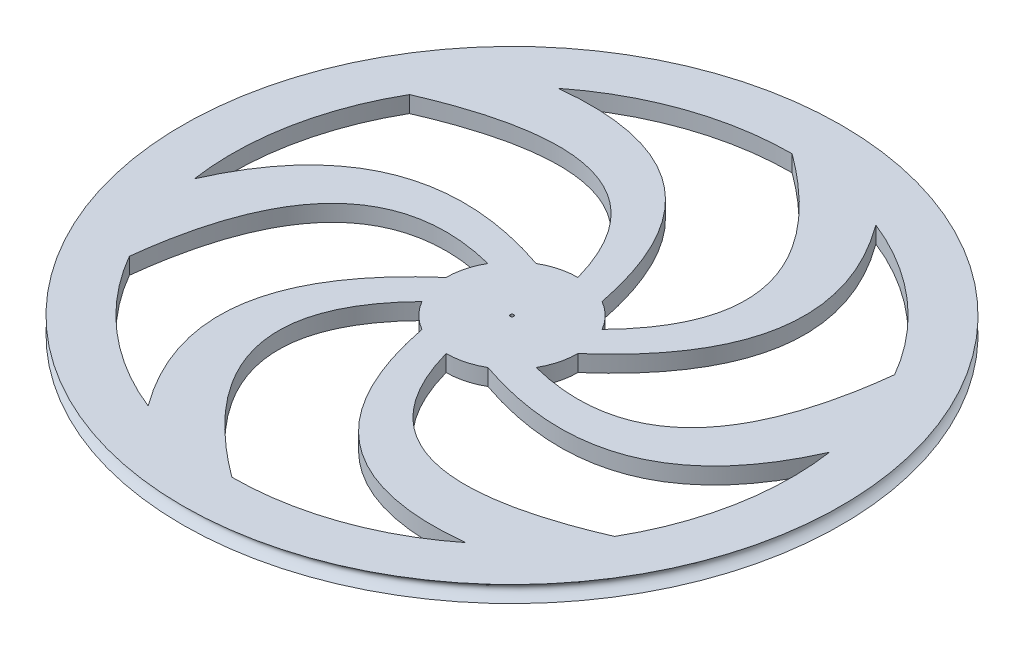
ISO-10303-21;
HEADER;
FILE_DESCRIPTION(('STEP AP214'),'2;1');
FILE_NAME('part.step','',(''),(''),'','','');
FILE_SCHEMA(('AUTOMOTIVE_DESIGN { 1 0 10303 214 1 1 1 1 }'));
ENDSEC;
DATA;
#1=APPLICATION_CONTEXT('core data for automotive mechanical design processes');
#2=APPLICATION_PROTOCOL_DEFINITION('international standard','automotive_design',2000,#1);
#3=PRODUCT_CONTEXT('',#1,'mechanical');
#4=PRODUCT('Part','Part','',(#3));
#5=PRODUCT_RELATED_PRODUCT_CATEGORY('part','',(#4));
#6=PRODUCT_DEFINITION_FORMATION('','',#4);
#7=PRODUCT_DEFINITION_CONTEXT('part definition',#1,'design');
#8=PRODUCT_DEFINITION('design','',#6,#7);
#9=PRODUCT_DEFINITION_SHAPE('','',#8);
#10=(LENGTH_UNIT() NAMED_UNIT(*) SI_UNIT(.MILLI.,.METRE.));
#11=(NAMED_UNIT(*) PLANE_ANGLE_UNIT() SI_UNIT($,.RADIAN.));
#12=(NAMED_UNIT(*) SI_UNIT($,.STERADIAN.) SOLID_ANGLE_UNIT());
#13=UNCERTAINTY_MEASURE_WITH_UNIT(LENGTH_MEASURE(1.E-05),#10,'distance_accuracy_value','');
#14=(GEOMETRIC_REPRESENTATION_CONTEXT(3) GLOBAL_UNCERTAINTY_ASSIGNED_CONTEXT((#13)) GLOBAL_UNIT_ASSIGNED_CONTEXT((#10,
#11,#12)) REPRESENTATION_CONTEXT('',''));
#15=CARTESIAN_POINT('',(0.,0.,0.));
#16=DIRECTION('',(0.,0.,1.));
#17=DIRECTION('',(1.,0.,0.));
#18=AXIS2_PLACEMENT_3D('',#15,#16,#17);
#19=CARTESIAN_POINT('',(0.,3.175,0.));
#20=DIRECTION('',(0.,-1.,0.));
#21=DIRECTION('',(0.,0.,-1.));
#22=AXIS2_PLACEMENT_3D('',#19,#20,#21);
#23=CYLINDRICAL_SURFACE('',#22,12.7);
#24=CARTESIAN_POINT('',(0.,0.,0.));
#25=DIRECTION('',(0.,1.,0.));
#26=DIRECTION('',(0.,0.,1.));
#27=AXIS2_PLACEMENT_3D('',#24,#25,#26);
#28=CIRCLE('',#27,12.7);
#29=CARTESIAN_POINT('',(10.9985226280624,0.,6.35000000000001));
#30=VERTEX_POINT('',#29);
#31=CARTESIAN_POINT('',(12.7,0.,0.));
#32=VERTEX_POINT('',#31);
#33=EDGE_CURVE('E390',#30,#32,#28,.T.);
#34=ORIENTED_EDGE('',*,*,#33,.T.);
#35=DIRECTION('',(0.,-1.,0.));
#36=VECTOR('',#35,1.);
#37=CARTESIAN_POINT('',(12.7,3.175,0.));
#38=LINE('',#37,#36);
#39=CARTESIAN_POINT('',(12.7,3.175,0.));
#40=VERTEX_POINT('',#39);
#41=EDGE_CURVE('E11',#40,#32,#38,.T.);
#42=ORIENTED_EDGE('',*,*,#41,.F.);
#43=CARTESIAN_POINT('',(0.,3.175,0.));
#44=DIRECTION('',(0.,1.,0.));
#45=DIRECTION('',(0.,0.,1.));
#46=AXIS2_PLACEMENT_3D('',#43,#44,#45);
#47=CIRCLE('',#46,12.7);
#48=CARTESIAN_POINT('',(10.9985226280624,3.175,6.35000000000001));
#49=VERTEX_POINT('',#48);
#50=EDGE_CURVE('E212',#49,#40,#47,.T.);
#51=ORIENTED_EDGE('',*,*,#50,.F.);
#52=DIRECTION('',(0.,-1.,0.));
#53=VECTOR('',#52,1.);
#54=CARTESIAN_POINT('',(10.9985226280624,3.175,6.35000000000001));
#55=LINE('',#54,#53);
#56=EDGE_CURVE('E55',#49,#30,#55,.T.);
#57=ORIENTED_EDGE('',*,*,#56,.T.);
#58=EDGE_LOOP('',(#34,#42,#51,#57));
#59=FACE_BOUND('',#58,.T.);
#60=ADVANCED_FACE('F35',(#59),#23,.T.);
#61=CARTESIAN_POINT('',(12.7,3.175,0.));
#62=CARTESIAN_POINT('',(39.5572930429573,3.175,-23.4186437139194));
#63=CARTESIAN_POINT('',(19.9617838015857,3.175,-50.1480589101787));
#64=B_SPLINE_CURVE_WITH_KNOTS('',2,(#61,#62,#63),.UNSPECIFIED.,.F.,.F.,(3,3),(0.,1.),.UNSPECIFIED.);
#65=DIRECTION('',(0.,-1.,0.));
#66=VECTOR('',#65,1.);
#67=SURFACE_OF_LINEAR_EXTRUSION('',#64,#66);
#68=CARTESIAN_POINT('',(12.7,0.,0.));
#69=CARTESIAN_POINT('',(39.5572930429573,0.,-23.4186437139194));
#70=CARTESIAN_POINT('',(19.9617838015857,0.,-50.1480589101787));
#71=B_SPLINE_CURVE_WITH_KNOTS('',2,(#68,#69,#70),.UNSPECIFIED.,.F.,.F.,(3,3),(0.,1.),.UNSPECIFIED.);
#72=CARTESIAN_POINT('',(19.9617838015857,0.,-50.1480589101787));
#73=VERTEX_POINT('',#72);
#74=EDGE_CURVE('E218',#32,#73,#71,.T.);
#75=ORIENTED_EDGE('',*,*,#74,.T.);
#76=DIRECTION('',(0.,-1.,0.));
#77=VECTOR('',#76,1.);
#78=CARTESIAN_POINT('',(19.9617838015857,3.175,-50.1480589101787));
#79=LINE('',#78,#77);
#80=CARTESIAN_POINT('',(19.9617838015857,3.175,-50.1480589101787));
#81=VERTEX_POINT('',#80);
#82=EDGE_CURVE('E46',#81,#73,#79,.T.);
#83=ORIENTED_EDGE('',*,*,#82,.F.);
#84=EDGE_CURVE('E205',#40,#81,#64,.T.);
#85=ORIENTED_EDGE('',*,*,#84,.F.);
#86=ORIENTED_EDGE('',*,*,#41,.T.);
#87=EDGE_LOOP('',(#75,#83,#85,#86));
#88=FACE_BOUND('',#87,.T.);
#89=ADVANCED_FACE('F217',(#88),#67,.F.);
#90=CARTESIAN_POINT('',(0.,3.175,0.));
#91=DIRECTION('',(0.,-1.,0.));
#92=DIRECTION('',(0.,0.,-1.));
#93=AXIS2_PLACEMENT_3D('',#90,#91,#92);
#94=CYLINDRICAL_SURFACE('',#93,53.975);
#95=CARTESIAN_POINT('',(0.,0.,0.));
#96=DIRECTION('',(0.,1.,0.));
#97=DIRECTION('',(0.,0.,1.));
#98=AXIS2_PLACEMENT_3D('',#95,#96,#97);
#99=CIRCLE('',#98,53.975);
#100=CARTESIAN_POINT('',(46.7437211692651,0.,-26.9875000000001));
#101=VERTEX_POINT('',#100);
#102=EDGE_CURVE('E395',#101,#73,#99,.T.);
#103=ORIENTED_EDGE('',*,*,#102,.F.);
#104=DIRECTION('',(0.,-1.,0.));
#105=VECTOR('',#104,1.);
#106=CARTESIAN_POINT('',(46.7437211692651,3.175,-26.9875000000001));
#107=LINE('',#106,#105);
#108=CARTESIAN_POINT('',(46.7437211692651,3.175,-26.9875000000001));
#109=VERTEX_POINT('',#108);
#110=EDGE_CURVE('E129',#109,#101,#107,.T.);
#111=ORIENTED_EDGE('',*,*,#110,.F.);
#112=CARTESIAN_POINT('',(0.,3.175,0.));
#113=DIRECTION('',(0.,1.,0.));
#114=DIRECTION('',(0.,0.,1.));
#115=AXIS2_PLACEMENT_3D('',#112,#113,#114);
#116=CIRCLE('',#115,53.975);
#117=EDGE_CURVE('E211',#109,#81,#116,.T.);
#118=ORIENTED_EDGE('',*,*,#117,.T.);
#119=ORIENTED_EDGE('',*,*,#82,.T.);
#120=EDGE_LOOP('',(#103,#111,#118,#119));
#121=FACE_BOUND('',#120,.T.);
#122=ADVANCED_FACE('F222',(#121),#94,.F.);
#123=CARTESIAN_POINT('',(-10.9985226280623,3.175,-6.35000000000009));
#124=CARTESIAN_POINT('',(-42.014338018492,3.175,-14.2639829231854));
#125=CARTESIAN_POINT('',(-46.7437211692653,3.175,26.9874999999996));
#126=B_SPLINE_CURVE_WITH_KNOTS('',2,(#123,#124,#125),.UNSPECIFIED.,.F.,.F.,(3,3),(0.,1.),.UNSPECIFIED.);
#127=DIRECTION('',(0.,-1.,0.));
#128=VECTOR('',#127,1.);
#129=SURFACE_OF_LINEAR_EXTRUSION('',#126,#128);
#130=CARTESIAN_POINT('',(-10.9985226280623,0.,-6.35000000000009));
#131=CARTESIAN_POINT('',(-42.014338018492,0.,-14.2639829231854));
#132=CARTESIAN_POINT('',(-46.7437211692653,0.,26.9874999999996));
#133=B_SPLINE_CURVE_WITH_KNOTS('',2,(#130,#131,#132),.UNSPECIFIED.,.F.,.F.,(3,3),(0.,1.),.UNSPECIFIED.);
#134=CARTESIAN_POINT('',(-10.9985226280623,0.,-6.35000000000009));
#135=VERTEX_POINT('',#134);
#136=CARTESIAN_POINT('',(-46.7437211692653,0.,26.9874999999996));
#137=VERTEX_POINT('',#136);
#138=EDGE_CURVE('E556',#135,#137,#133,.T.);
#139=ORIENTED_EDGE('',*,*,#138,.F.);
#140=DIRECTION('',(0.,-1.,0.));
#141=VECTOR('',#140,1.);
#142=CARTESIAN_POINT('',(-10.9985226280623,3.175,-6.35000000000009));
#143=LINE('',#142,#141);
#144=CARTESIAN_POINT('',(-10.9985226280623,3.175,-6.35000000000009));
#145=VERTEX_POINT('',#144);
#146=EDGE_CURVE('E420',#145,#135,#143,.T.);
#147=ORIENTED_EDGE('',*,*,#146,.F.);
#148=CARTESIAN_POINT('',(-46.7437211692653,3.175,26.9874999999996));
#149=VERTEX_POINT('',#148);
#150=EDGE_CURVE('E264',#145,#149,#126,.T.);
#151=ORIENTED_EDGE('',*,*,#150,.T.);
#152=DIRECTION('',(0.,-1.,0.));
#153=VECTOR('',#152,1.);
#154=CARTESIAN_POINT('',(-46.7437211692653,3.175,26.9874999999996));
#155=LINE('',#154,#153);
#156=EDGE_CURVE('E422',#149,#137,#155,.T.);
#157=ORIENTED_EDGE('',*,*,#156,.T.);
#158=EDGE_LOOP('',(#139,#147,#151,#157));
#159=FACE_BOUND('',#158,.T.);
#160=ADVANCED_FACE('F297',(#159),#129,.T.);
#161=CARTESIAN_POINT('',(0.,3.175,0.));
#162=DIRECTION('',(0.,-1.,0.));
#163=DIRECTION('',(0.,0.,-1.));
#164=AXIS2_PLACEMENT_3D('',#161,#162,#163);
#165=CYLINDRICAL_SURFACE('',#164,12.7);
#166=CARTESIAN_POINT('',(0.,0.,0.));
#167=DIRECTION('',(0.,1.,0.));
#168=DIRECTION('',(0.,0.,1.));
#169=AXIS2_PLACEMENT_3D('',#166,#167,#168);
#170=CIRCLE('',#169,12.7);
#171=CARTESIAN_POINT('',(-12.7,0.,0.));
#172=VERTEX_POINT('',#171);
#173=EDGE_CURVE('E517',#135,#172,#170,.T.);
#174=ORIENTED_EDGE('',*,*,#173,.T.);
#175=DIRECTION('',(0.,-1.,0.));
#176=VECTOR('',#175,1.);
#177=CARTESIAN_POINT('',(-12.7,3.175,0.));
#178=LINE('',#177,#176);
#179=CARTESIAN_POINT('',(-12.7,3.175,0.));
#180=VERTEX_POINT('',#179);
#181=EDGE_CURVE('E427',#180,#172,#178,.T.);
#182=ORIENTED_EDGE('',*,*,#181,.F.);
#183=CARTESIAN_POINT('',(0.,3.175,0.));
#184=DIRECTION('',(0.,1.,0.));
#185=DIRECTION('',(0.,0.,1.));
#186=AXIS2_PLACEMENT_3D('',#183,#184,#185);
#187=CIRCLE('',#186,12.7);
#188=EDGE_CURVE('E269',#145,#180,#187,.T.);
#189=ORIENTED_EDGE('',*,*,#188,.F.);
#190=ORIENTED_EDGE('',*,*,#146,.T.);
#191=EDGE_LOOP('',(#174,#182,#189,#190));
#192=FACE_BOUND('',#191,.T.);
#193=ADVANCED_FACE('F372',(#192),#165,.T.);
#194=CARTESIAN_POINT('',(-12.7,3.175,0.));
#195=CARTESIAN_POINT('',(-39.5572930429574,3.175,23.4186437139191));
#196=CARTESIAN_POINT('',(-19.9617838015861,3.175,50.1480589101785));
#197=B_SPLINE_CURVE_WITH_KNOTS('',2,(#194,#195,#196),.UNSPECIFIED.,.F.,.F.,(3,3),(0.,1.),.UNSPECIFIED.);
#198=DIRECTION('',(0.,-1.,0.));
#199=VECTOR('',#198,1.);
#200=SURFACE_OF_LINEAR_EXTRUSION('',#197,#199);
#201=CARTESIAN_POINT('',(-12.7,0.,0.));
#202=CARTESIAN_POINT('',(-39.5572930429574,0.,23.4186437139191));
#203=CARTESIAN_POINT('',(-19.9617838015861,0.,50.1480589101785));
#204=B_SPLINE_CURVE_WITH_KNOTS('',2,(#201,#202,#203),.UNSPECIFIED.,.F.,.F.,(3,3),(0.,1.),.UNSPECIFIED.);
#205=CARTESIAN_POINT('',(-19.9617838015861,0.,50.1480589101785));
#206=VERTEX_POINT('',#205);
#207=EDGE_CURVE('E398',#172,#206,#204,.T.);
#208=ORIENTED_EDGE('',*,*,#207,.T.);
#209=DIRECTION('',(0.,-1.,0.));
#210=VECTOR('',#209,1.);
#211=CARTESIAN_POINT('',(-19.9617838015861,3.175,50.1480589101785));
#212=LINE('',#211,#210);
#213=CARTESIAN_POINT('',(-19.9617838015861,3.175,50.1480589101785));
#214=VERTEX_POINT('',#213);
#215=EDGE_CURVE('E424',#214,#206,#212,.T.);
#216=ORIENTED_EDGE('',*,*,#215,.F.);
#217=EDGE_CURVE('E232',#180,#214,#197,.T.);
#218=ORIENTED_EDGE('',*,*,#217,.F.);
#219=ORIENTED_EDGE('',*,*,#181,.T.);
#220=EDGE_LOOP('',(#208,#216,#218,#219));
#221=FACE_BOUND('',#220,.T.);
#222=ADVANCED_FACE('F302',(#221),#200,.F.);
#223=CARTESIAN_POINT('',(-10.9985226280624,3.175,6.34999999999993));
#224=CARTESIAN_POINT('',(-33.3601405798719,3.175,29.2534925856078));
#225=CARTESIAN_POINT('',(-3.69497971292815E-13,3.175,53.975));
#226=B_SPLINE_CURVE_WITH_KNOTS('',2,(#223,#224,#225),.UNSPECIFIED.,.F.,.F.,(3,3),(0.,1.),.UNSPECIFIED.);
#227=DIRECTION('',(0.,-1.,0.));
#228=VECTOR('',#227,1.);
#229=SURFACE_OF_LINEAR_EXTRUSION('',#226,#228);
#230=CARTESIAN_POINT('',(-10.9985226280624,0.,6.34999999999993));
#231=CARTESIAN_POINT('',(-33.3601405798719,0.,29.2534925856078));
#232=CARTESIAN_POINT('',(-3.69497971292815E-13,0.,53.975));
#233=B_SPLINE_CURVE_WITH_KNOTS('',2,(#230,#231,#232),.UNSPECIFIED.,.F.,.F.,(3,3),(0.,1.),.UNSPECIFIED.);
#234=CARTESIAN_POINT('',(-10.9985226280624,0.,6.34999999999994));
#235=VERTEX_POINT('',#234);
#236=CARTESIAN_POINT('',(-1.84748985646408E-13,0.,53.975));
#237=VERTEX_POINT('',#236);
#238=EDGE_CURVE('E540',#235,#237,#233,.T.);
#239=ORIENTED_EDGE('',*,*,#238,.F.);
#240=DIRECTION('',(0.,-1.,0.));
#241=VECTOR('',#240,1.);
#242=CARTESIAN_POINT('',(-10.9985226280624,3.175,6.34999999999994));
#243=LINE('',#242,#241);
#244=CARTESIAN_POINT('',(-10.9985226280624,3.175,6.34999999999994));
#245=VERTEX_POINT('',#244);
#246=EDGE_CURVE('E425',#245,#235,#243,.T.);
#247=ORIENTED_EDGE('',*,*,#246,.F.);
#248=CARTESIAN_POINT('',(-1.84748985646408E-13,3.175,53.975));
#249=VERTEX_POINT('',#248);
#250=EDGE_CURVE('E260',#245,#249,#226,.T.);
#251=ORIENTED_EDGE('',*,*,#250,.T.);
#252=DIRECTION('',(0.,-1.,0.));
#253=VECTOR('',#252,1.);
#254=CARTESIAN_POINT('',(-1.84748985646408E-13,3.175,53.975));
#255=LINE('',#254,#253);
#256=EDGE_CURVE('E431',#249,#237,#255,.T.);
#257=ORIENTED_EDGE('',*,*,#256,.T.);
#258=EDGE_LOOP('',(#239,#247,#251,#257));
#259=FACE_BOUND('',#258,.T.);
#260=ADVANCED_FACE('F299',(#259),#229,.T.);
#261=CARTESIAN_POINT('',(-6.35000000000005,0.,10.9985226280623));
#262=VERTEX_POINT('',#261);
#263=EDGE_CURVE('E548',#235,#262,#170,.T.);
#264=ORIENTED_EDGE('',*,*,#263,.T.);
#265=DIRECTION('',(0.,-1.,0.));
#266=VECTOR('',#265,1.);
#267=CARTESIAN_POINT('',(-6.35000000000005,3.175,10.9985226280623));
#268=LINE('',#267,#266);
#269=CARTESIAN_POINT('',(-6.35000000000005,3.175,10.9985226280623));
#270=VERTEX_POINT('',#269);
#271=EDGE_CURVE('E436',#270,#262,#268,.T.);
#272=ORIENTED_EDGE('',*,*,#271,.F.);
#273=EDGE_CURVE('E253',#245,#270,#187,.T.);
#274=ORIENTED_EDGE('',*,*,#273,.F.);
#275=ORIENTED_EDGE('',*,*,#246,.T.);
#276=EDGE_LOOP('',(#264,#272,#274,#275));
#277=FACE_BOUND('',#276,.T.);
#278=ADVANCED_FACE('F295',(#277),#165,.T.);
#279=CARTESIAN_POINT('',(-6.35000000000005,3.175,10.9985226280623));
#280=CARTESIAN_POINT('',(0.502493856952142,3.175,45.9669425371061));
#281=CARTESIAN_POINT('',(33.4486010659002,3.175,42.3614413321154));
#282=B_SPLINE_CURVE_WITH_KNOTS('',2,(#279,#280,#281),.UNSPECIFIED.,.F.,.F.,(3,3),(0.,1.),.UNSPECIFIED.);
#283=DIRECTION('',(0.,-1.,0.));
#284=VECTOR('',#283,1.);
#285=SURFACE_OF_LINEAR_EXTRUSION('',#282,#284);
#286=CARTESIAN_POINT('',(-6.35000000000005,0.,10.9985226280623));
#287=CARTESIAN_POINT('',(0.502493856952142,0.,45.9669425371061));
#288=CARTESIAN_POINT('',(33.4486010659002,0.,42.3614413321154));
#289=B_SPLINE_CURVE_WITH_KNOTS('',2,(#286,#287,#288),.UNSPECIFIED.,.F.,.F.,(3,3),(0.,1.),.UNSPECIFIED.);
#290=CARTESIAN_POINT('',(33.4486010659002,0.,42.3614413321154));
#291=VERTEX_POINT('',#290);
#292=EDGE_CURVE('E549',#262,#291,#289,.T.);
#293=ORIENTED_EDGE('',*,*,#292,.T.);
#294=DIRECTION('',(0.,-1.,0.));
#295=VECTOR('',#294,1.);
#296=CARTESIAN_POINT('',(33.4486010659002,3.175,42.3614413321154));
#297=LINE('',#296,#295);
#298=CARTESIAN_POINT('',(33.4486010659002,3.175,42.3614413321154));
#299=VERTEX_POINT('',#298);
#300=EDGE_CURVE('E433',#299,#291,#297,.T.);
#301=ORIENTED_EDGE('',*,*,#300,.F.);
#302=EDGE_CURVE('E265',#270,#299,#282,.T.);
#303=ORIENTED_EDGE('',*,*,#302,.F.);
#304=ORIENTED_EDGE('',*,*,#271,.T.);
#305=EDGE_LOOP('',(#293,#301,#303,#304));
#306=FACE_BOUND('',#305,.T.);
#307=ADVANCED_FACE('F290',(#306),#285,.F.);
#308=CARTESIAN_POINT('',(0.,0.,12.7));
#309=VERTEX_POINT('',#308);
#310=CARTESIAN_POINT('',(6.34999999999997,0.,10.9985226280624));
#311=VERTEX_POINT('',#310);
#312=EDGE_CURVE('E518',#309,#311,#170,.T.);
#313=ORIENTED_EDGE('',*,*,#312,.T.);
#314=DIRECTION('',(0.,-1.,0.));
#315=VECTOR('',#314,1.);
#316=CARTESIAN_POINT('',(6.34999999999997,3.175,10.9985226280624));
#317=LINE('',#316,#315);
#318=CARTESIAN_POINT('',(6.34999999999997,3.175,10.9985226280624));
#319=VERTEX_POINT('',#318);
#320=EDGE_CURVE('E434',#319,#311,#317,.T.);
#321=ORIENTED_EDGE('',*,*,#320,.F.);
#322=CARTESIAN_POINT('',(0.,3.175,12.7));
#323=VERTEX_POINT('',#322);
#324=EDGE_CURVE('E244',#323,#319,#187,.T.);
#325=ORIENTED_EDGE('',*,*,#324,.F.);
#326=DIRECTION('',(0.,-1.,0.));
#327=VECTOR('',#326,1.);
#328=CARTESIAN_POINT('',(0.,3.175,12.7));
#329=LINE('',#328,#327);
#330=EDGE_CURVE('E440',#323,#309,#329,.T.);
#331=ORIENTED_EDGE('',*,*,#330,.T.);
#332=EDGE_LOOP('',(#313,#321,#325,#331));
#333=FACE_BOUND('',#332,.T.);
#334=ADVANCED_FACE('F294',(#333),#165,.T.);
#335=CARTESIAN_POINT('',(6.34999999999997,3.175,10.9985226280624));
#336=CARTESIAN_POINT('',(40.0597868999095,3.175,22.5482988231868));
#337=CARTESIAN_POINT('',(53.4103848674862,3.175,-7.78661757806325));
#338=B_SPLINE_CURVE_WITH_KNOTS('',2,(#335,#336,#337),.UNSPECIFIED.,.F.,.F.,(3,3),(0.,1.),.UNSPECIFIED.);
#339=DIRECTION('',(0.,-1.,0.));
#340=VECTOR('',#339,1.);
#341=SURFACE_OF_LINEAR_EXTRUSION('',#338,#340);
#342=CARTESIAN_POINT('',(6.34999999999997,0.,10.9985226280624));
#343=CARTESIAN_POINT('',(40.0597868999095,0.,22.5482988231868));
#344=CARTESIAN_POINT('',(53.4103848674862,0.,-7.78661757806325));
#345=B_SPLINE_CURVE_WITH_KNOTS('',2,(#342,#343,#344),.UNSPECIFIED.,.F.,.F.,(3,3),(0.,1.),.UNSPECIFIED.);
#346=CARTESIAN_POINT('',(53.4103848674862,0.,-7.78661757806325));
#347=VERTEX_POINT('',#346);
#348=EDGE_CURVE('E523',#311,#347,#345,.T.);
#349=ORIENTED_EDGE('',*,*,#348,.T.);
#350=DIRECTION('',(0.,-1.,0.));
#351=VECTOR('',#350,1.);
#352=CARTESIAN_POINT('',(53.4103848674862,3.175,-7.78661757806325));
#353=LINE('',#352,#351);
#354=CARTESIAN_POINT('',(53.4103848674862,3.175,-7.78661757806325));
#355=VERTEX_POINT('',#354);
#356=EDGE_CURVE('E445',#355,#347,#353,.T.);
#357=ORIENTED_EDGE('',*,*,#356,.F.);
#358=EDGE_CURVE('E250',#319,#355,#338,.T.);
#359=ORIENTED_EDGE('',*,*,#358,.F.);
#360=ORIENTED_EDGE('',*,*,#320,.T.);
#361=EDGE_LOOP('',(#349,#357,#359,#360));
#362=FACE_BOUND('',#361,.T.);
#363=ADVANCED_FACE('F310',(#362),#341,.F.);
#364=CARTESIAN_POINT('',(46.7437211692651,0.,26.9875000000001));
#365=VERTEX_POINT('',#364);
#366=EDGE_CURVE('E531',#365,#347,#99,.T.);
#367=ORIENTED_EDGE('',*,*,#366,.F.);
#368=DIRECTION('',(0.,-1.,0.));
#369=VECTOR('',#368,1.);
#370=CARTESIAN_POINT('',(46.7437211692651,3.175,26.9875000000001));
#371=LINE('',#370,#369);
#372=CARTESIAN_POINT('',(46.7437211692651,3.175,26.9875000000001));
#373=VERTEX_POINT('',#372);
#374=EDGE_CURVE('E442',#373,#365,#371,.T.);
#375=ORIENTED_EDGE('',*,*,#374,.F.);
#376=EDGE_CURVE('E246',#373,#355,#116,.T.);
#377=ORIENTED_EDGE('',*,*,#376,.T.);
#378=ORIENTED_EDGE('',*,*,#356,.T.);
#379=EDGE_LOOP('',(#367,#375,#377,#378));
#380=FACE_BOUND('',#379,.T.);
#381=ADVANCED_FACE('F339',(#380),#94,.F.);
#382=CARTESIAN_POINT('',(1.30971622436249E-13,3.175,-12.7));
#383=CARTESIAN_POINT('',(-8.65419743861992,3.175,-43.5174755087932));
#384=CARTESIAN_POINT('',(-46.7437211692648,3.175,-26.9875000000005));
#385=B_SPLINE_CURVE_WITH_KNOTS('',2,(#382,#383,#384),.UNSPECIFIED.,.F.,.F.,(3,3),(0.,1.),.UNSPECIFIED.);
#386=DIRECTION('',(0.,-1.,0.));
#387=VECTOR('',#386,1.);
#388=SURFACE_OF_LINEAR_EXTRUSION('',#385,#387);
#389=CARTESIAN_POINT('',(1.30971622436249E-13,0.,-12.7));
#390=CARTESIAN_POINT('',(-8.65419743861992,0.,-43.5174755087932));
#391=CARTESIAN_POINT('',(-46.7437211692648,0.,-26.9875000000005));
#392=B_SPLINE_CURVE_WITH_KNOTS('',2,(#389,#390,#391),.UNSPECIFIED.,.F.,.F.,(3,3),(0.,1.),.UNSPECIFIED.);
#393=CARTESIAN_POINT('',(0.,0.,-12.7));
#394=VERTEX_POINT('',#393);
#395=CARTESIAN_POINT('',(-46.7437211692648,0.,-26.9875000000005));
#396=VERTEX_POINT('',#395);
#397=EDGE_CURVE('E505',#394,#396,#392,.T.);
#398=ORIENTED_EDGE('',*,*,#397,.F.);
#399=DIRECTION('',(0.,-1.,0.));
#400=VECTOR('',#399,1.);
#401=CARTESIAN_POINT('',(0.,3.175,-12.7));
#402=LINE('',#401,#400);
#403=CARTESIAN_POINT('',(0.,3.175,-12.7));
#404=VERTEX_POINT('',#403);
#405=EDGE_CURVE('E443',#404,#394,#402,.T.);
#406=ORIENTED_EDGE('',*,*,#405,.F.);
#407=CARTESIAN_POINT('',(-46.7437211692648,3.175,-26.9875000000005));
#408=VERTEX_POINT('',#407);
#409=EDGE_CURVE('E241',#404,#408,#385,.T.);
#410=ORIENTED_EDGE('',*,*,#409,.T.);
#411=DIRECTION('',(0.,-1.,0.));
#412=VECTOR('',#411,1.);
#413=CARTESIAN_POINT('',(-46.7437211692648,3.175,-26.9875000000005));
#414=LINE('',#413,#412);
#415=EDGE_CURVE('E449',#408,#396,#414,.T.);
#416=ORIENTED_EDGE('',*,*,#415,.T.);
#417=EDGE_LOOP('',(#398,#406,#410,#416));
#418=FACE_BOUND('',#417,.T.);
#419=ADVANCED_FACE('F336',(#418),#388,.T.);
#420=CARTESIAN_POINT('',(-6.3499999999999,0.,-10.9985226280624));
#421=VERTEX_POINT('',#420);
#422=EDGE_CURVE('E510',#394,#421,#170,.T.);
#423=ORIENTED_EDGE('',*,*,#422,.T.);
#424=DIRECTION('',(0.,-1.,0.));
#425=VECTOR('',#424,1.);
#426=CARTESIAN_POINT('',(-6.3499999999999,3.175,-10.9985226280624));
#427=LINE('',#426,#425);
#428=CARTESIAN_POINT('',(-6.3499999999999,3.175,-10.9985226280624));
#429=VERTEX_POINT('',#428);
#430=EDGE_CURVE('E453',#429,#421,#427,.T.);
#431=ORIENTED_EDGE('',*,*,#430,.F.);
#432=EDGE_CURVE('E252',#404,#429,#187,.T.);
#433=ORIENTED_EDGE('',*,*,#432,.F.);
#434=ORIENTED_EDGE('',*,*,#405,.T.);
#435=EDGE_LOOP('',(#423,#431,#433,#434));
#436=FACE_BOUND('',#435,.T.);
#437=ADVANCED_FACE('F334',(#436),#165,.T.);
#438=CARTESIAN_POINT('',(-6.3499999999999,3.175,-10.9985226280624));
#439=CARTESIAN_POINT('',(-40.0597868999093,3.175,-22.548298823187));
#440=CARTESIAN_POINT('',(-53.4103848674862,3.175,7.78661757806289));
#441=B_SPLINE_CURVE_WITH_KNOTS('',2,(#438,#439,#440),.UNSPECIFIED.,.F.,.F.,(3,3),(0.,1.),.UNSPECIFIED.);
#442=DIRECTION('',(0.,-1.,0.));
#443=VECTOR('',#442,1.);
#444=SURFACE_OF_LINEAR_EXTRUSION('',#441,#443);
#445=CARTESIAN_POINT('',(-6.3499999999999,0.,-10.9985226280624));
#446=CARTESIAN_POINT('',(-40.0597868999093,0.,-22.548298823187));
#447=CARTESIAN_POINT('',(-53.4103848674862,0.,7.78661757806289));
#448=B_SPLINE_CURVE_WITH_KNOTS('',2,(#445,#446,#447),.UNSPECIFIED.,.F.,.F.,(3,3),(0.,1.),.UNSPECIFIED.);
#449=CARTESIAN_POINT('',(-53.4103848674862,0.,7.78661757806289));
#450=VERTEX_POINT('',#449);
#451=EDGE_CURVE('E516',#421,#450,#448,.T.);
#452=ORIENTED_EDGE('',*,*,#451,.T.);
#453=DIRECTION('',(0.,-1.,0.));
#454=VECTOR('',#453,1.);
#455=CARTESIAN_POINT('',(-53.4103848674862,3.175,7.78661757806289));
#456=LINE('',#455,#454);
#457=CARTESIAN_POINT('',(-53.4103848674862,3.175,7.78661757806289));
#458=VERTEX_POINT('',#457);
#459=EDGE_CURVE('E451',#458,#450,#456,.T.);
#460=ORIENTED_EDGE('',*,*,#459,.F.);
#461=EDGE_CURVE('E245',#429,#458,#441,.T.);
#462=ORIENTED_EDGE('',*,*,#461,.F.);
#463=ORIENTED_EDGE('',*,*,#430,.T.);
#464=EDGE_LOOP('',(#452,#460,#462,#463));
#465=FACE_BOUND('',#464,.T.);
#466=ADVANCED_FACE('F331',(#465),#444,.F.);
#467=CARTESIAN_POINT('',(10.9985226280624,3.175,-6.35));
#468=CARTESIAN_POINT('',(33.3601405798718,3.175,-29.253492585608));
#469=CARTESIAN_POINT('',(0.,3.175,-53.975));
#470=B_SPLINE_CURVE_WITH_KNOTS('',2,(#467,#468,#469),.UNSPECIFIED.,.F.,.F.,(3,3),(0.,1.),.UNSPECIFIED.);
#471=DIRECTION('',(0.,-1.,0.));
#472=VECTOR('',#471,1.);
#473=SURFACE_OF_LINEAR_EXTRUSION('',#470,#472);
#474=CARTESIAN_POINT('',(10.9985226280624,0.,-6.35));
#475=CARTESIAN_POINT('',(33.3601405798718,0.,-29.253492585608));
#476=CARTESIAN_POINT('',(0.,0.,-53.975));
#477=B_SPLINE_CURVE_WITH_KNOTS('',2,(#474,#475,#476),.UNSPECIFIED.,.F.,.F.,(3,3),(0.,1.),.UNSPECIFIED.);
#478=CARTESIAN_POINT('',(10.9985226280624,0.,-6.35000000000001));
#479=VERTEX_POINT('',#478);
#480=CARTESIAN_POINT('',(0.,0.,-53.975));
#481=VERTEX_POINT('',#480);
#482=EDGE_CURVE('E476',#479,#481,#477,.T.);
#483=ORIENTED_EDGE('',*,*,#482,.F.);
#484=DIRECTION('',(0.,-1.,0.));
#485=VECTOR('',#484,1.);
#486=CARTESIAN_POINT('',(10.9985226280624,3.175,-6.35000000000001));
#487=LINE('',#486,#485);
#488=CARTESIAN_POINT('',(10.9985226280624,3.175,-6.35000000000001));
#489=VERTEX_POINT('',#488);
#490=EDGE_CURVE('E40',#489,#479,#487,.T.);
#491=ORIENTED_EDGE('',*,*,#490,.F.);
#492=CARTESIAN_POINT('',(0.,3.175,-53.975));
#493=VERTEX_POINT('',#492);
#494=EDGE_CURVE('E415',#489,#493,#470,.T.);
#495=ORIENTED_EDGE('',*,*,#494,.T.);
#496=DIRECTION('',(0.,-1.,0.));
#497=VECTOR('',#496,1.);
#498=CARTESIAN_POINT('',(0.,3.175,-53.975));
#499=LINE('',#498,#497);
#500=EDGE_CURVE('E227',#493,#481,#499,.T.);
#501=ORIENTED_EDGE('',*,*,#500,.T.);
#502=EDGE_LOOP('',(#483,#491,#495,#501));
#503=FACE_BOUND('',#502,.T.);
#504=ADVANCED_FACE('F37',(#503),#473,.T.);
#505=CARTESIAN_POINT('',(0.,3.175,0.));
#506=DIRECTION('',(0.,-1.,0.));
#507=DIRECTION('',(0.,0.,-1.));
#508=AXIS2_PLACEMENT_3D('',#505,#506,#507);
#509=CYLINDRICAL_SURFACE('',#508,12.7);
#510=CARTESIAN_POINT('',(0.,0.,0.));
#511=DIRECTION('',(0.,1.,0.));
#512=DIRECTION('',(0.,0.,1.));
#513=AXIS2_PLACEMENT_3D('',#510,#511,#512);
#514=CIRCLE('',#513,12.7);
#515=CARTESIAN_POINT('',(6.35000000000013,0.,-10.9985226280623));
#516=VERTEX_POINT('',#515);
#517=EDGE_CURVE('E469',#479,#516,#514,.T.);
#518=ORIENTED_EDGE('',*,*,#517,.T.);
#519=DIRECTION('',(0.,-1.,0.));
#520=VECTOR('',#519,1.);
#521=CARTESIAN_POINT('',(6.35000000000013,3.175,-10.9985226280623));
#522=LINE('',#521,#520);
#523=CARTESIAN_POINT('',(6.35000000000013,3.175,-10.9985226280623));
#524=VERTEX_POINT('',#523);
#525=EDGE_CURVE('E459',#524,#516,#522,.T.);
#526=ORIENTED_EDGE('',*,*,#525,.F.);
#527=CARTESIAN_POINT('',(0.,3.175,0.));
#528=DIRECTION('',(0.,1.,0.));
#529=DIRECTION('',(0.,0.,1.));
#530=AXIS2_PLACEMENT_3D('',#527,#528,#529);
#531=CIRCLE('',#530,12.7);
#532=EDGE_CURVE('E242',#489,#524,#531,.T.);
#533=ORIENTED_EDGE('',*,*,#532,.F.);
#534=ORIENTED_EDGE('',*,*,#490,.T.);
#535=EDGE_LOOP('',(#518,#526,#533,#534));
#536=FACE_BOUND('',#535,.T.);
#537=ADVANCED_FACE('F468',(#536),#509,.T.);
#538=CARTESIAN_POINT('',(6.35000000000013,3.175,-10.9985226280623));
#539=CARTESIAN_POINT('',(-0.502493856951835,3.175,-45.9669425371061));
#540=CARTESIAN_POINT('',(-33.4486010658999,3.175,-42.3614413321157));
#541=B_SPLINE_CURVE_WITH_KNOTS('',2,(#538,#539,#540),.UNSPECIFIED.,.F.,.F.,(3,3),(0.,1.),.UNSPECIFIED.);
#542=DIRECTION('',(0.,-1.,0.));
#543=VECTOR('',#542,1.);
#544=SURFACE_OF_LINEAR_EXTRUSION('',#541,#543);
#545=CARTESIAN_POINT('',(6.35000000000013,0.,-10.9985226280623));
#546=CARTESIAN_POINT('',(-0.502493856951835,0.,-45.9669425371061));
#547=CARTESIAN_POINT('',(-33.4486010658999,0.,-42.3614413321157));
#548=B_SPLINE_CURVE_WITH_KNOTS('',2,(#545,#546,#547),.UNSPECIFIED.,.F.,.F.,(3,3),(0.,1.),.UNSPECIFIED.);
#549=CARTESIAN_POINT('',(-33.4486010658999,0.,-42.3614413321157));
#550=VERTEX_POINT('',#549);
#551=EDGE_CURVE('E478',#516,#550,#548,.T.);
#552=ORIENTED_EDGE('',*,*,#551,.T.);
#553=DIRECTION('',(0.,-1.,0.));
#554=VECTOR('',#553,1.);
#555=CARTESIAN_POINT('',(-33.4486010658999,3.175,-42.3614413321157));
#556=LINE('',#555,#554);
#557=CARTESIAN_POINT('',(-33.4486010658999,3.175,-42.3614413321157));
#558=VERTEX_POINT('',#557);
#559=EDGE_CURVE('E458',#558,#550,#556,.T.);
#560=ORIENTED_EDGE('',*,*,#559,.F.);
#561=EDGE_CURVE('E236',#524,#558,#541,.T.);
#562=ORIENTED_EDGE('',*,*,#561,.F.);
#563=ORIENTED_EDGE('',*,*,#525,.T.);
#564=EDGE_LOOP('',(#552,#560,#562,#563));
#565=FACE_BOUND('',#564,.T.);
#566=ADVANCED_FACE('F626',(#565),#544,.F.);
#567=CARTESIAN_POINT('',(10.9985226280624,3.175,6.35000000000001));
#568=CARTESIAN_POINT('',(42.0143380184921,3.175,14.2639829231851));
#569=CARTESIAN_POINT('',(46.7437211692651,3.175,-26.9875));
#570=B_SPLINE_CURVE_WITH_KNOTS('',2,(#567,#568,#569),.UNSPECIFIED.,.F.,.F.,(3,3),(0.,1.),.UNSPECIFIED.);
#571=DIRECTION('',(0.,-1.,0.));
#572=VECTOR('',#571,1.);
#573=SURFACE_OF_LINEAR_EXTRUSION('',#570,#572);
#574=CARTESIAN_POINT('',(10.9985226280624,0.,6.35000000000001));
#575=CARTESIAN_POINT('',(42.0143380184921,0.,14.2639829231851));
#576=CARTESIAN_POINT('',(46.7437211692651,0.,-26.9875));
#577=B_SPLINE_CURVE_WITH_KNOTS('',2,(#574,#575,#576),.UNSPECIFIED.,.F.,.F.,(3,3),(0.,1.),.UNSPECIFIED.);
#578=EDGE_CURVE('E408',#30,#101,#577,.T.);
#579=ORIENTED_EDGE('',*,*,#578,.F.);
#580=ORIENTED_EDGE('',*,*,#56,.F.);
#581=EDGE_CURVE('E223',#49,#109,#570,.T.);
#582=ORIENTED_EDGE('',*,*,#581,.T.);
#583=ORIENTED_EDGE('',*,*,#110,.T.);
#584=EDGE_LOOP('',(#579,#580,#582,#583));
#585=FACE_BOUND('',#584,.T.);
#586=ADVANCED_FACE('F628',(#585),#573,.T.);
#587=EDGE_CURVE('E393',#137,#206,#99,.T.);
#588=ORIENTED_EDGE('',*,*,#587,.F.);
#589=ORIENTED_EDGE('',*,*,#156,.F.);
#590=EDGE_CURVE('E225',#149,#214,#116,.T.);
#591=ORIENTED_EDGE('',*,*,#590,.T.);
#592=ORIENTED_EDGE('',*,*,#215,.T.);
#593=EDGE_LOOP('',(#588,#589,#591,#592));
#594=FACE_BOUND('',#593,.T.);
#595=ADVANCED_FACE('F596',(#594),#94,.F.);
#596=EDGE_CURVE('E400',#237,#291,#99,.T.);
#597=ORIENTED_EDGE('',*,*,#596,.F.);
#598=ORIENTED_EDGE('',*,*,#256,.F.);
#599=EDGE_CURVE('E233',#249,#299,#116,.T.);
#600=ORIENTED_EDGE('',*,*,#599,.T.);
#601=ORIENTED_EDGE('',*,*,#300,.T.);
#602=EDGE_LOOP('',(#597,#598,#600,#601));
#603=FACE_BOUND('',#602,.T.);
#604=ADVANCED_FACE('F308',(#603),#94,.F.);
#605=CARTESIAN_POINT('',(0.,3.175,12.7));
#606=CARTESIAN_POINT('',(8.65419743862024,3.175,43.5174755087932));
#607=CARTESIAN_POINT('',(46.743721169265,3.175,26.9875));
#608=B_SPLINE_CURVE_WITH_KNOTS('',2,(#605,#606,#607),.UNSPECIFIED.,.F.,.F.,(3,3),(0.,1.),.UNSPECIFIED.);
#609=DIRECTION('',(0.,-1.,0.));
#610=VECTOR('',#609,1.);
#611=SURFACE_OF_LINEAR_EXTRUSION('',#608,#610);
#612=CARTESIAN_POINT('',(0.,0.,12.7));
#613=CARTESIAN_POINT('',(8.65419743862024,0.,43.5174755087932));
#614=CARTESIAN_POINT('',(46.743721169265,0.,26.9875));
#615=B_SPLINE_CURVE_WITH_KNOTS('',2,(#612,#613,#614),.UNSPECIFIED.,.F.,.F.,(3,3),(0.,1.),.UNSPECIFIED.);
#616=EDGE_CURVE('E532',#309,#365,#615,.T.);
#617=ORIENTED_EDGE('',*,*,#616,.F.);
#618=ORIENTED_EDGE('',*,*,#330,.F.);
#619=EDGE_CURVE('E256',#323,#373,#608,.T.);
#620=ORIENTED_EDGE('',*,*,#619,.T.);
#621=ORIENTED_EDGE('',*,*,#374,.T.);
#622=EDGE_LOOP('',(#617,#618,#620,#621));
#623=FACE_BOUND('',#622,.T.);
#624=ADVANCED_FACE('F304',(#623),#611,.T.);
#625=EDGE_CURVE('E502',#396,#450,#99,.T.);
#626=ORIENTED_EDGE('',*,*,#625,.F.);
#627=ORIENTED_EDGE('',*,*,#415,.F.);
#628=EDGE_CURVE('E237',#408,#458,#116,.T.);
#629=ORIENTED_EDGE('',*,*,#628,.T.);
#630=ORIENTED_EDGE('',*,*,#459,.T.);
#631=EDGE_LOOP('',(#626,#627,#629,#630));
#632=FACE_BOUND('',#631,.T.);
#633=ADVANCED_FACE('F307',(#632),#94,.F.);
#634=CARTESIAN_POINT('',(0.,3.175,0.));
#635=DIRECTION('',(0.,-1.,0.));
#636=DIRECTION('',(0.,0.,-1.));
#637=AXIS2_PLACEMENT_3D('',#634,#635,#636);
#638=CYLINDRICAL_SURFACE('',#637,0.3175);
#639=CARTESIAN_POINT('',(0.,3.175,0.));
#640=DIRECTION('',(0.,1.,0.));
#641=DIRECTION('',(0.,0.,1.));
#642=AXIS2_PLACEMENT_3D('',#639,#640,#641);
#643=CIRCLE('',#642,0.3175);
#644=CARTESIAN_POINT('',(0.,3.175,0.3175));
#645=VERTEX_POINT('',#644);
#646=EDGE_CURVE('E235',#645,#645,#643,.T.);
#647=ORIENTED_EDGE('',*,*,#646,.T.);
#648=EDGE_LOOP('',(#647));
#649=FACE_BOUND('',#648,.T.);
#650=CARTESIAN_POINT('',(0.,0.,0.));
#651=DIRECTION('',(0.,1.,0.));
#652=DIRECTION('',(0.,0.,1.));
#653=AXIS2_PLACEMENT_3D('',#650,#651,#652);
#654=CIRCLE('',#653,0.3175);
#655=CARTESIAN_POINT('',(0.,0.,0.3175));
#656=VERTEX_POINT('',#655);
#657=EDGE_CURVE('E501',#656,#656,#654,.T.);
#658=ORIENTED_EDGE('',*,*,#657,.F.);
#659=EDGE_LOOP('',(#658));
#660=FACE_BOUND('',#659,.T.);
#661=ADVANCED_FACE('F341',(#649,#660),#638,.F.);
#662=EDGE_CURVE('E496',#481,#550,#99,.T.);
#663=ORIENTED_EDGE('',*,*,#662,.F.);
#664=ORIENTED_EDGE('',*,*,#500,.F.);
#665=EDGE_CURVE('E226',#493,#558,#116,.T.);
#666=ORIENTED_EDGE('',*,*,#665,.T.);
#667=ORIENTED_EDGE('',*,*,#559,.T.);
#668=EDGE_LOOP('',(#663,#664,#666,#667));
#669=FACE_BOUND('',#668,.T.);
#670=ADVANCED_FACE('F591',(#669),#94,.F.);
#671=CARTESIAN_POINT('',(0.,3.175,0.));
#672=DIRECTION('',(0.,1.,0.));
#673=DIRECTION('',(0.,0.,1.));
#674=AXIS2_PLACEMENT_3D('',#671,#672,#673);
#675=PLANE('',#674);
#676=ORIENTED_EDGE('',*,*,#494,.F.);
#677=ORIENTED_EDGE('',*,*,#532,.T.);
#678=ORIENTED_EDGE('',*,*,#561,.T.);
#679=ORIENTED_EDGE('',*,*,#665,.F.);
#680=EDGE_LOOP('',(#676,#677,#678,#679));
#681=FACE_BOUND('',#680,.T.);
#682=ORIENTED_EDGE('',*,*,#646,.F.);
#683=EDGE_LOOP('',(#682));
#684=FACE_BOUND('',#683,.T.);
#685=ORIENTED_EDGE('',*,*,#409,.F.);
#686=ORIENTED_EDGE('',*,*,#432,.T.);
#687=ORIENTED_EDGE('',*,*,#461,.T.);
#688=ORIENTED_EDGE('',*,*,#628,.F.);
#689=EDGE_LOOP('',(#685,#686,#687,#688));
#690=FACE_BOUND('',#689,.T.);
#691=ORIENTED_EDGE('',*,*,#324,.T.);
#692=ORIENTED_EDGE('',*,*,#358,.T.);
#693=ORIENTED_EDGE('',*,*,#376,.F.);
#694=ORIENTED_EDGE('',*,*,#619,.F.);
#695=EDGE_LOOP('',(#691,#692,#693,#694));
#696=FACE_BOUND('',#695,.T.);
#697=ORIENTED_EDGE('',*,*,#250,.F.);
#698=ORIENTED_EDGE('',*,*,#273,.T.);
#699=ORIENTED_EDGE('',*,*,#302,.T.);
#700=ORIENTED_EDGE('',*,*,#599,.F.);
#701=EDGE_LOOP('',(#697,#698,#699,#700));
#702=FACE_BOUND('',#701,.T.);
#703=ORIENTED_EDGE('',*,*,#150,.F.);
#704=ORIENTED_EDGE('',*,*,#188,.T.);
#705=ORIENTED_EDGE('',*,*,#217,.T.);
#706=ORIENTED_EDGE('',*,*,#590,.F.);
#707=EDGE_LOOP('',(#703,#704,#705,#706));
#708=FACE_BOUND('',#707,.T.);
#709=ORIENTED_EDGE('',*,*,#50,.T.);
#710=ORIENTED_EDGE('',*,*,#84,.T.);
#711=ORIENTED_EDGE('',*,*,#117,.F.);
#712=ORIENTED_EDGE('',*,*,#581,.F.);
#713=EDGE_LOOP('',(#709,#710,#711,#712));
#714=FACE_BOUND('',#713,.T.);
#715=CARTESIAN_POINT('',(0.,3.175,0.));
#716=DIRECTION('',(0.,-1.,0.));
#717=DIRECTION('',(0.,0.,-1.));
#718=AXIS2_PLACEMENT_3D('',#715,#716,#717);
#719=CIRCLE('',#718,63.5);
#720=CARTESIAN_POINT('',(0.,3.175,-63.5));
#721=VERTEX_POINT('',#720);
#722=EDGE_CURVE('E483',#721,#721,#719,.T.);
#723=ORIENTED_EDGE('',*,*,#722,.F.);
#724=EDGE_LOOP('',(#723));
#725=FACE_BOUND('',#724,.T.);
#726=ADVANCED_FACE('F207',(#681,#684,#690,#696,#702,#708,#714,#725),#675,.T.);
#727=CARTESIAN_POINT('',(0.,0.,0.));
#728=DIRECTION('',(0.,1.,0.));
#729=DIRECTION('',(0.,0.,1.));
#730=AXIS2_PLACEMENT_3D('',#727,#728,#729);
#731=PLANE('',#730);
#732=ORIENTED_EDGE('',*,*,#482,.T.);
#733=ORIENTED_EDGE('',*,*,#662,.T.);
#734=ORIENTED_EDGE('',*,*,#551,.F.);
#735=ORIENTED_EDGE('',*,*,#517,.F.);
#736=EDGE_LOOP('',(#732,#733,#734,#735));
#737=FACE_BOUND('',#736,.T.);
#738=ORIENTED_EDGE('',*,*,#657,.T.);
#739=EDGE_LOOP('',(#738));
#740=FACE_BOUND('',#739,.T.);
#741=ORIENTED_EDGE('',*,*,#397,.T.);
#742=ORIENTED_EDGE('',*,*,#625,.T.);
#743=ORIENTED_EDGE('',*,*,#451,.F.);
#744=ORIENTED_EDGE('',*,*,#422,.F.);
#745=EDGE_LOOP('',(#741,#742,#743,#744));
#746=FACE_BOUND('',#745,.T.);
#747=ORIENTED_EDGE('',*,*,#312,.F.);
#748=ORIENTED_EDGE('',*,*,#616,.T.);
#749=ORIENTED_EDGE('',*,*,#366,.T.);
#750=ORIENTED_EDGE('',*,*,#348,.F.);
#751=EDGE_LOOP('',(#747,#748,#749,#750));
#752=FACE_BOUND('',#751,.T.);
#753=ORIENTED_EDGE('',*,*,#238,.T.);
#754=ORIENTED_EDGE('',*,*,#596,.T.);
#755=ORIENTED_EDGE('',*,*,#292,.F.);
#756=ORIENTED_EDGE('',*,*,#263,.F.);
#757=EDGE_LOOP('',(#753,#754,#755,#756));
#758=FACE_BOUND('',#757,.T.);
#759=ORIENTED_EDGE('',*,*,#138,.T.);
#760=ORIENTED_EDGE('',*,*,#587,.T.);
#761=ORIENTED_EDGE('',*,*,#207,.F.);
#762=ORIENTED_EDGE('',*,*,#173,.F.);
#763=EDGE_LOOP('',(#759,#760,#761,#762));
#764=FACE_BOUND('',#763,.T.);
#765=ORIENTED_EDGE('',*,*,#33,.F.);
#766=ORIENTED_EDGE('',*,*,#578,.T.);
#767=ORIENTED_EDGE('',*,*,#102,.T.);
#768=ORIENTED_EDGE('',*,*,#74,.F.);
#769=EDGE_LOOP('',(#765,#766,#767,#768));
#770=FACE_BOUND('',#769,.T.);
#771=CARTESIAN_POINT('',(0.,0.,0.));
#772=DIRECTION('',(0.,-1.,0.));
#773=DIRECTION('',(0.,0.,-1.));
#774=AXIS2_PLACEMENT_3D('',#771,#772,#773);
#775=CIRCLE('',#774,63.5);
#776=CARTESIAN_POINT('',(0.,0.,-63.5));
#777=VERTEX_POINT('',#776);
#778=EDGE_CURVE('E480',#777,#777,#775,.T.);
#779=ORIENTED_EDGE('',*,*,#778,.T.);
#780=EDGE_LOOP('',(#779));
#781=FACE_BOUND('',#780,.T.);
#782=ADVANCED_FACE('F473',(#737,#740,#746,#752,#758,#764,#770,#781),#731,.F.);
#783=CARTESIAN_POINT('',(-63.5,3.175,0.));
#784=CARTESIAN_POINT('',(-60.325,1.5875,0.));
#785=CARTESIAN_POINT('',(-63.5,0.,0.));
#786=B_SPLINE_CURVE_WITH_KNOTS('',2,(#783,#784,#785),.UNSPECIFIED.,.F.,.F.,(3,3),(0.,1.),.UNSPECIFIED.);
#787=CARTESIAN_POINT('',(0.,0.,0.));
#788=DIRECTION('',(0.,-1.,0.));
#789=AXIS1_PLACEMENT('',#787,#788);
#790=SURFACE_OF_REVOLUTION('',#786,#789);
#791=ORIENTED_EDGE('',*,*,#778,.F.);
#792=EDGE_LOOP('',(#791));
#793=FACE_BOUND('',#792,.T.);
#794=ORIENTED_EDGE('',*,*,#722,.T.);
#795=EDGE_LOOP('',(#794));
#796=FACE_BOUND('',#795,.T.);
#797=ADVANCED_FACE('F598',(#793,#796),#790,.T.);
#798=CLOSED_SHELL('',(#60,#89,#122,#160,#193,#222,#260,#278,#307,#334,#363,#381,#419,#437,#466,
#504,#537,#566,#586,#595,#604,#624,#633,#661,#670,#726,#782,#797));
#799=MANIFOLD_SOLID_BREP('B2',#798);
#800=ADVANCED_BREP_SHAPE_REPRESENTATION('',(#18,#799),#14);
#801=SHAPE_DEFINITION_REPRESENTATION(#9,#800);
ENDSEC;
END-ISO-10303-21;
